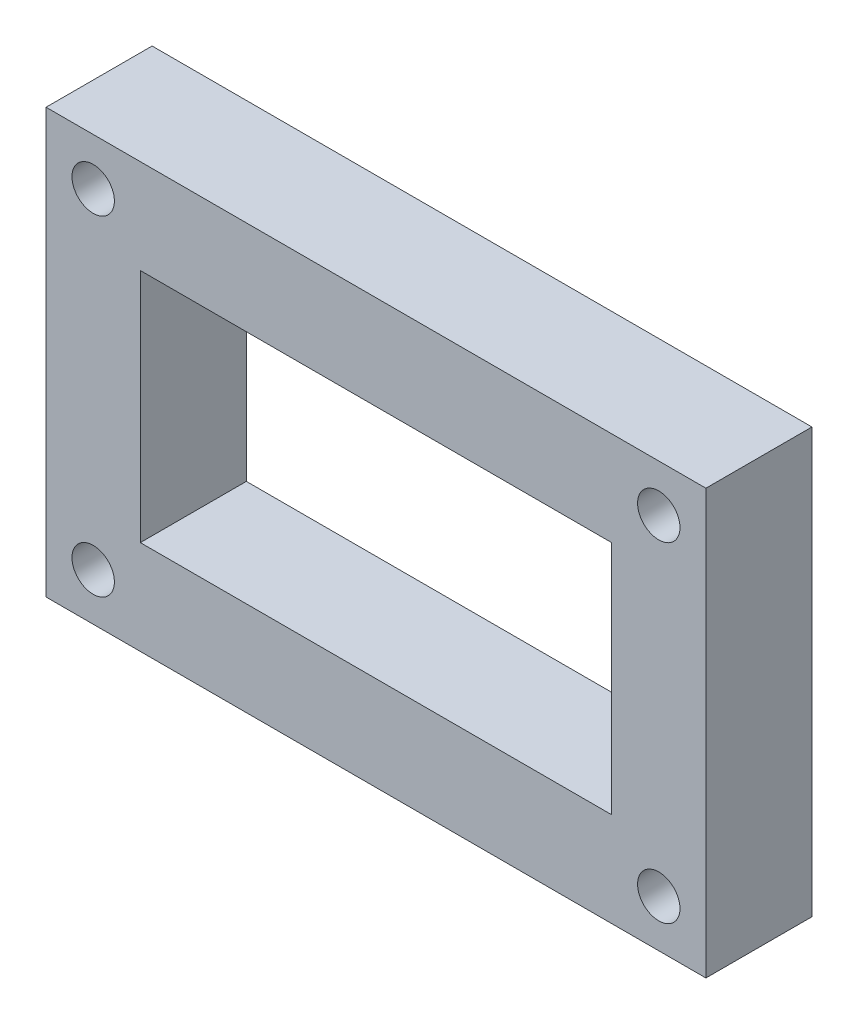
ISO-10303-21;
HEADER;
FILE_DESCRIPTION(('STEP AP214'),'2;1');
FILE_NAME('part.step','',(''),(''),'','','');
FILE_SCHEMA(('AUTOMOTIVE_DESIGN { 1 0 10303 214 1 1 1 1 }'));
ENDSEC;
DATA;
#1=APPLICATION_CONTEXT('core data for automotive mechanical design processes');
#2=APPLICATION_PROTOCOL_DEFINITION('international standard','automotive_design',2000,#1);
#3=PRODUCT_CONTEXT('',#1,'mechanical');
#4=PRODUCT('Part','Part','',(#3));
#5=PRODUCT_RELATED_PRODUCT_CATEGORY('part','',(#4));
#6=PRODUCT_DEFINITION_FORMATION('','',#4);
#7=PRODUCT_DEFINITION_CONTEXT('part definition',#1,'design');
#8=PRODUCT_DEFINITION('design','',#6,#7);
#9=PRODUCT_DEFINITION_SHAPE('','',#8);
#10=(LENGTH_UNIT() NAMED_UNIT(*) SI_UNIT(.MILLI.,.METRE.));
#11=(NAMED_UNIT(*) PLANE_ANGLE_UNIT() SI_UNIT($,.RADIAN.));
#12=(NAMED_UNIT(*) SI_UNIT($,.STERADIAN.) SOLID_ANGLE_UNIT());
#13=UNCERTAINTY_MEASURE_WITH_UNIT(LENGTH_MEASURE(1.E-05),#10,'distance_accuracy_value','');
#14=(GEOMETRIC_REPRESENTATION_CONTEXT(3) GLOBAL_UNCERTAINTY_ASSIGNED_CONTEXT((#13)) GLOBAL_UNIT_ASSIGNED_CONTEXT((#10,
#11,#12)) REPRESENTATION_CONTEXT('',''));
#15=CARTESIAN_POINT('',(0.,0.,0.));
#16=DIRECTION('',(0.,0.,1.));
#17=DIRECTION('',(1.,0.,0.));
#18=AXIS2_PLACEMENT_3D('',#15,#16,#17);
#19=CARTESIAN_POINT('',(0.,0.,11.43));
#20=DIRECTION('',(0.,0.,1.));
#21=DIRECTION('',(1.,0.,0.));
#22=AXIS2_PLACEMENT_3D('',#19,#20,#21);
#23=PLANE('',#22);
#24=CARTESIAN_POINT('',(30.48,-17.78,11.43));
#25=DIRECTION('',(0.,0.,1.));
#26=DIRECTION('',(1.,0.,0.));
#27=AXIS2_PLACEMENT_3D('',#24,#25,#26);
#28=CIRCLE('',#27,2.286);
#29=CARTESIAN_POINT('',(32.766,-17.78,11.43));
#30=VERTEX_POINT('',#29);
#31=EDGE_CURVE('E281',#30,#30,#28,.T.);
#32=ORIENTED_EDGE('',*,*,#31,.F.);
#33=EDGE_LOOP('',(#32));
#34=FACE_BOUND('',#33,.T.);
#35=CARTESIAN_POINT('',(-30.48,17.78,11.43));
#36=DIRECTION('',(0.,0.,1.));
#37=DIRECTION('',(1.,0.,0.));
#38=AXIS2_PLACEMENT_3D('',#35,#36,#37);
#39=CIRCLE('',#38,2.286);
#40=CARTESIAN_POINT('',(-28.194,17.78,11.43));
#41=VERTEX_POINT('',#40);
#42=EDGE_CURVE('E144',#41,#41,#39,.T.);
#43=ORIENTED_EDGE('',*,*,#42,.F.);
#44=EDGE_LOOP('',(#43));
#45=FACE_BOUND('',#44,.T.);
#46=DIRECTION('',(0.,1.,0.));
#47=VECTOR('',#46,1.);
#48=CARTESIAN_POINT('',(35.56,22.86,11.43));
#49=LINE('',#48,#47);
#50=CARTESIAN_POINT('',(35.56,-22.86,11.43));
#51=VERTEX_POINT('',#50);
#52=CARTESIAN_POINT('',(35.56,22.86,11.43));
#53=VERTEX_POINT('',#52);
#54=EDGE_CURVE('E160',#51,#53,#49,.T.);
#55=ORIENTED_EDGE('',*,*,#54,.T.);
#56=DIRECTION('',(-1.,0.,0.));
#57=VECTOR('',#56,1.);
#58=CARTESIAN_POINT('',(-35.56,22.86,11.43));
#59=LINE('',#58,#57);
#60=CARTESIAN_POINT('',(-35.56,22.86,11.43));
#61=VERTEX_POINT('',#60);
#62=EDGE_CURVE('E164',#53,#61,#59,.T.);
#63=ORIENTED_EDGE('',*,*,#62,.T.);
#64=DIRECTION('',(0.,-1.,0.));
#65=VECTOR('',#64,1.);
#66=CARTESIAN_POINT('',(-35.56,22.86,11.43));
#67=LINE('',#66,#65);
#68=CARTESIAN_POINT('',(-35.56,-22.86,11.43));
#69=VERTEX_POINT('',#68);
#70=EDGE_CURVE('E168',#61,#69,#67,.T.);
#71=ORIENTED_EDGE('',*,*,#70,.T.);
#72=DIRECTION('',(1.,0.,0.));
#73=VECTOR('',#72,1.);
#74=CARTESIAN_POINT('',(-35.56,-22.86,11.43));
#75=LINE('',#74,#73);
#76=EDGE_CURVE('E171',#69,#51,#75,.T.);
#77=ORIENTED_EDGE('',*,*,#76,.T.);
#78=EDGE_LOOP('',(#55,#63,#71,#77));
#79=FACE_BOUND('',#78,.T.);
#80=DIRECTION('',(-1.,0.,0.));
#81=VECTOR('',#80,1.);
#82=CARTESIAN_POINT('',(-25.4,12.7,11.43));
#83=LINE('',#82,#81);
#84=CARTESIAN_POINT('',(25.4,12.7,11.43));
#85=VERTEX_POINT('',#84);
#86=CARTESIAN_POINT('',(-25.4,12.7,11.43));
#87=VERTEX_POINT('',#86);
#88=EDGE_CURVE('E118',#85,#87,#83,.T.);
#89=ORIENTED_EDGE('',*,*,#88,.F.);
#90=DIRECTION('',(0.,1.,0.));
#91=VECTOR('',#90,1.);
#92=CARTESIAN_POINT('',(25.4,12.7,11.43));
#93=LINE('',#92,#91);
#94=CARTESIAN_POINT('',(25.4,-12.7,11.43));
#95=VERTEX_POINT('',#94);
#96=EDGE_CURVE('E109',#95,#85,#93,.T.);
#97=ORIENTED_EDGE('',*,*,#96,.F.);
#98=DIRECTION('',(1.,0.,0.));
#99=VECTOR('',#98,1.);
#100=CARTESIAN_POINT('',(-25.4,-12.7,11.43));
#101=LINE('',#100,#99);
#102=CARTESIAN_POINT('',(-25.4,-12.7,11.43));
#103=VERTEX_POINT('',#102);
#104=EDGE_CURVE('E136',#103,#95,#101,.T.);
#105=ORIENTED_EDGE('',*,*,#104,.F.);
#106=DIRECTION('',(0.,-1.,0.));
#107=VECTOR('',#106,1.);
#108=CARTESIAN_POINT('',(-25.4,12.7,11.43));
#109=LINE('',#108,#107);
#110=EDGE_CURVE('E132',#87,#103,#109,.T.);
#111=ORIENTED_EDGE('',*,*,#110,.F.);
#112=EDGE_LOOP('',(#89,#97,#105,#111));
#113=FACE_BOUND('',#112,.T.);
#114=CARTESIAN_POINT('',(-30.48,-17.78,11.43));
#115=DIRECTION('',(0.,0.,1.));
#116=DIRECTION('',(1.,0.,0.));
#117=AXIS2_PLACEMENT_3D('',#114,#115,#116);
#118=CIRCLE('',#117,2.286);
#119=CARTESIAN_POINT('',(-28.194,-17.78,11.43));
#120=VERTEX_POINT('',#119);
#121=EDGE_CURVE('E289',#120,#120,#118,.T.);
#122=ORIENTED_EDGE('',*,*,#121,.F.);
#123=EDGE_LOOP('',(#122));
#124=FACE_BOUND('',#123,.T.);
#125=CARTESIAN_POINT('',(30.48,17.78,11.43));
#126=DIRECTION('',(0.,0.,1.));
#127=DIRECTION('',(1.,0.,0.));
#128=AXIS2_PLACEMENT_3D('',#125,#126,#127);
#129=CIRCLE('',#128,2.286);
#130=CARTESIAN_POINT('',(32.766,17.78,11.43));
#131=VERTEX_POINT('',#130);
#132=EDGE_CURVE('E270',#131,#131,#129,.T.);
#133=ORIENTED_EDGE('',*,*,#132,.F.);
#134=EDGE_LOOP('',(#133));
#135=FACE_BOUND('',#134,.T.);
#136=ADVANCED_FACE('F43',(#34,#45,#79,#113,#124,#135),#23,.T.);
#137=CARTESIAN_POINT('',(0.,0.,0.));
#138=DIRECTION('',(0.,0.,1.));
#139=DIRECTION('',(1.,0.,0.));
#140=AXIS2_PLACEMENT_3D('',#137,#138,#139);
#141=PLANE('',#140);
#142=DIRECTION('',(0.,1.,0.));
#143=VECTOR('',#142,1.);
#144=CARTESIAN_POINT('',(35.56,22.86,0.));
#145=LINE('',#144,#143);
#146=CARTESIAN_POINT('',(35.56,-22.86,0.));
#147=VERTEX_POINT('',#146);
#148=CARTESIAN_POINT('',(35.56,22.86,0.));
#149=VERTEX_POINT('',#148);
#150=EDGE_CURVE('E127',#147,#149,#145,.T.);
#151=ORIENTED_EDGE('',*,*,#150,.F.);
#152=DIRECTION('',(1.,0.,0.));
#153=VECTOR('',#152,1.);
#154=CARTESIAN_POINT('',(-35.56,-22.86,0.));
#155=LINE('',#154,#153);
#156=CARTESIAN_POINT('',(-35.56,-22.86,0.));
#157=VERTEX_POINT('',#156);
#158=EDGE_CURVE('E165',#157,#147,#155,.T.);
#159=ORIENTED_EDGE('',*,*,#158,.F.);
#160=DIRECTION('',(0.,-1.,0.));
#161=VECTOR('',#160,1.);
#162=CARTESIAN_POINT('',(-35.56,22.86,0.));
#163=LINE('',#162,#161);
#164=CARTESIAN_POINT('',(-35.56,22.86,0.));
#165=VERTEX_POINT('',#164);
#166=EDGE_CURVE('E181',#165,#157,#163,.T.);
#167=ORIENTED_EDGE('',*,*,#166,.F.);
#168=DIRECTION('',(-1.,0.,0.));
#169=VECTOR('',#168,1.);
#170=CARTESIAN_POINT('',(-35.56,22.86,0.));
#171=LINE('',#170,#169);
#172=EDGE_CURVE('E178',#149,#165,#171,.T.);
#173=ORIENTED_EDGE('',*,*,#172,.F.);
#174=EDGE_LOOP('',(#151,#159,#167,#173));
#175=FACE_BOUND('',#174,.T.);
#176=DIRECTION('',(0.,1.,0.));
#177=VECTOR('',#176,1.);
#178=CARTESIAN_POINT('',(25.4,12.7,0.));
#179=LINE('',#178,#177);
#180=CARTESIAN_POINT('',(25.4,-12.7,0.));
#181=VERTEX_POINT('',#180);
#182=CARTESIAN_POINT('',(25.4,12.7,0.));
#183=VERTEX_POINT('',#182);
#184=EDGE_CURVE('E67',#181,#183,#179,.T.);
#185=ORIENTED_EDGE('',*,*,#184,.T.);
#186=DIRECTION('',(-1.,0.,0.));
#187=VECTOR('',#186,1.);
#188=CARTESIAN_POINT('',(-25.4,12.7,0.));
#189=LINE('',#188,#187);
#190=CARTESIAN_POINT('',(-25.4,12.7,0.));
#191=VERTEX_POINT('',#190);
#192=EDGE_CURVE('E125',#183,#191,#189,.T.);
#193=ORIENTED_EDGE('',*,*,#192,.T.);
#194=DIRECTION('',(0.,-1.,0.));
#195=VECTOR('',#194,1.);
#196=CARTESIAN_POINT('',(-25.4,12.7,0.));
#197=LINE('',#196,#195);
#198=CARTESIAN_POINT('',(-25.4,-12.7,0.));
#199=VERTEX_POINT('',#198);
#200=EDGE_CURVE('E147',#191,#199,#197,.T.);
#201=ORIENTED_EDGE('',*,*,#200,.T.);
#202=DIRECTION('',(1.,0.,0.));
#203=VECTOR('',#202,1.);
#204=CARTESIAN_POINT('',(-25.4,-12.7,0.));
#205=LINE('',#204,#203);
#206=EDGE_CURVE('E119',#199,#181,#205,.T.);
#207=ORIENTED_EDGE('',*,*,#206,.T.);
#208=EDGE_LOOP('',(#185,#193,#201,#207));
#209=FACE_BOUND('',#208,.T.);
#210=CARTESIAN_POINT('',(-30.48,17.78,0.));
#211=DIRECTION('',(0.,0.,1.));
#212=DIRECTION('',(1.,0.,0.));
#213=AXIS2_PLACEMENT_3D('',#210,#211,#212);
#214=CIRCLE('',#213,2.286);
#215=CARTESIAN_POINT('',(-28.194,17.78,0.));
#216=VERTEX_POINT('',#215);
#217=EDGE_CURVE('E293',#216,#216,#214,.T.);
#218=ORIENTED_EDGE('',*,*,#217,.T.);
#219=EDGE_LOOP('',(#218));
#220=FACE_BOUND('',#219,.T.);
#221=CARTESIAN_POINT('',(-30.48,-17.78,0.));
#222=DIRECTION('',(0.,0.,1.));
#223=DIRECTION('',(1.,0.,0.));
#224=AXIS2_PLACEMENT_3D('',#221,#222,#223);
#225=CIRCLE('',#224,2.286);
#226=CARTESIAN_POINT('',(-28.194,-17.78,0.));
#227=VERTEX_POINT('',#226);
#228=EDGE_CURVE('E285',#227,#227,#225,.T.);
#229=ORIENTED_EDGE('',*,*,#228,.T.);
#230=EDGE_LOOP('',(#229));
#231=FACE_BOUND('',#230,.T.);
#232=CARTESIAN_POINT('',(30.48,-17.78,0.));
#233=DIRECTION('',(0.,0.,1.));
#234=DIRECTION('',(1.,0.,0.));
#235=AXIS2_PLACEMENT_3D('',#232,#233,#234);
#236=CIRCLE('',#235,2.286);
#237=CARTESIAN_POINT('',(32.766,-17.78,0.));
#238=VERTEX_POINT('',#237);
#239=EDGE_CURVE('E278',#238,#238,#236,.T.);
#240=ORIENTED_EDGE('',*,*,#239,.T.);
#241=EDGE_LOOP('',(#240));
#242=FACE_BOUND('',#241,.T.);
#243=CARTESIAN_POINT('',(30.48,17.78,0.));
#244=DIRECTION('',(0.,0.,1.));
#245=DIRECTION('',(1.,0.,0.));
#246=AXIS2_PLACEMENT_3D('',#243,#244,#245);
#247=CIRCLE('',#246,2.286);
#248=CARTESIAN_POINT('',(32.766,17.78,0.));
#249=VERTEX_POINT('',#248);
#250=EDGE_CURVE('E273',#249,#249,#247,.T.);
#251=ORIENTED_EDGE('',*,*,#250,.T.);
#252=EDGE_LOOP('',(#251));
#253=FACE_BOUND('',#252,.T.);
#254=ADVANCED_FACE('F204',(#175,#209,#220,#231,#242,#253),#141,.F.);
#255=CARTESIAN_POINT('',(35.56,22.86,11.43));
#256=DIRECTION('',(-1.,0.,0.));
#257=DIRECTION('',(0.,0.,1.));
#258=AXIS2_PLACEMENT_3D('',#255,#256,#257);
#259=PLANE('',#258);
#260=ORIENTED_EDGE('',*,*,#150,.T.);
#261=DIRECTION('',(0.,0.,-1.));
#262=VECTOR('',#261,1.);
#263=CARTESIAN_POINT('',(35.56,22.86,11.43));
#264=LINE('',#263,#262);
#265=EDGE_CURVE('E11',#53,#149,#264,.T.);
#266=ORIENTED_EDGE('',*,*,#265,.F.);
#267=ORIENTED_EDGE('',*,*,#54,.F.);
#268=DIRECTION('',(0.,0.,-1.));
#269=VECTOR('',#268,1.);
#270=CARTESIAN_POINT('',(35.56,-22.86,11.43));
#271=LINE('',#270,#269);
#272=EDGE_CURVE('E174',#51,#147,#271,.T.);
#273=ORIENTED_EDGE('',*,*,#272,.T.);
#274=EDGE_LOOP('',(#260,#266,#267,#273));
#275=FACE_BOUND('',#274,.T.);
#276=ADVANCED_FACE('F45',(#275),#259,.F.);
#277=CARTESIAN_POINT('',(-35.56,22.86,11.43));
#278=DIRECTION('',(0.,-1.,0.));
#279=DIRECTION('',(0.,0.,-1.));
#280=AXIS2_PLACEMENT_3D('',#277,#278,#279);
#281=PLANE('',#280);
#282=ORIENTED_EDGE('',*,*,#172,.T.);
#283=DIRECTION('',(0.,0.,-1.));
#284=VECTOR('',#283,1.);
#285=CARTESIAN_POINT('',(-35.56,22.86,11.43));
#286=LINE('',#285,#284);
#287=EDGE_CURVE('E52',#61,#165,#286,.T.);
#288=ORIENTED_EDGE('',*,*,#287,.F.);
#289=ORIENTED_EDGE('',*,*,#62,.F.);
#290=ORIENTED_EDGE('',*,*,#265,.T.);
#291=EDGE_LOOP('',(#282,#288,#289,#290));
#292=FACE_BOUND('',#291,.T.);
#293=ADVANCED_FACE('F214',(#292),#281,.F.);
#294=CARTESIAN_POINT('',(-35.56,22.86,11.43));
#295=DIRECTION('',(1.,0.,0.));
#296=DIRECTION('',(0.,0.,-1.));
#297=AXIS2_PLACEMENT_3D('',#294,#295,#296);
#298=PLANE('',#297);
#299=ORIENTED_EDGE('',*,*,#166,.T.);
#300=DIRECTION('',(0.,0.,-1.));
#301=VECTOR('',#300,1.);
#302=CARTESIAN_POINT('',(-35.56,-22.86,11.43));
#303=LINE('',#302,#301);
#304=EDGE_CURVE('E189',#69,#157,#303,.T.);
#305=ORIENTED_EDGE('',*,*,#304,.F.);
#306=ORIENTED_EDGE('',*,*,#70,.F.);
#307=ORIENTED_EDGE('',*,*,#287,.T.);
#308=EDGE_LOOP('',(#299,#305,#306,#307));
#309=FACE_BOUND('',#308,.T.);
#310=ADVANCED_FACE('F198',(#309),#298,.F.);
#311=CARTESIAN_POINT('',(-35.56,-22.86,11.43));
#312=DIRECTION('',(0.,1.,0.));
#313=DIRECTION('',(0.,0.,1.));
#314=AXIS2_PLACEMENT_3D('',#311,#312,#313);
#315=PLANE('',#314);
#316=ORIENTED_EDGE('',*,*,#158,.T.);
#317=ORIENTED_EDGE('',*,*,#272,.F.);
#318=ORIENTED_EDGE('',*,*,#76,.F.);
#319=ORIENTED_EDGE('',*,*,#304,.T.);
#320=EDGE_LOOP('',(#316,#317,#318,#319));
#321=FACE_BOUND('',#320,.T.);
#322=ADVANCED_FACE('F208',(#321),#315,.F.);
#323=CARTESIAN_POINT('',(25.4,12.7,11.43));
#324=DIRECTION('',(-1.,0.,0.));
#325=DIRECTION('',(0.,0.,1.));
#326=AXIS2_PLACEMENT_3D('',#323,#324,#325);
#327=PLANE('',#326);
#328=ORIENTED_EDGE('',*,*,#184,.F.);
#329=DIRECTION('',(0.,0.,-1.));
#330=VECTOR('',#329,1.);
#331=CARTESIAN_POINT('',(25.4,-12.7,11.43));
#332=LINE('',#331,#330);
#333=EDGE_CURVE('E113',#95,#181,#332,.T.);
#334=ORIENTED_EDGE('',*,*,#333,.F.);
#335=ORIENTED_EDGE('',*,*,#96,.T.);
#336=DIRECTION('',(0.,0.,-1.));
#337=VECTOR('',#336,1.);
#338=CARTESIAN_POINT('',(25.4,12.7,11.43));
#339=LINE('',#338,#337);
#340=EDGE_CURVE('E112',#85,#183,#339,.T.);
#341=ORIENTED_EDGE('',*,*,#340,.T.);
#342=EDGE_LOOP('',(#328,#334,#335,#341));
#343=FACE_BOUND('',#342,.T.);
#344=ADVANCED_FACE('F111',(#343),#327,.T.);
#345=CARTESIAN_POINT('',(-25.4,12.7,11.43));
#346=DIRECTION('',(0.,-1.,0.));
#347=DIRECTION('',(0.,0.,-1.));
#348=AXIS2_PLACEMENT_3D('',#345,#346,#347);
#349=PLANE('',#348);
#350=ORIENTED_EDGE('',*,*,#192,.F.);
#351=ORIENTED_EDGE('',*,*,#340,.F.);
#352=ORIENTED_EDGE('',*,*,#88,.T.);
#353=DIRECTION('',(0.,0.,-1.));
#354=VECTOR('',#353,1.);
#355=CARTESIAN_POINT('',(-25.4,12.7,11.43));
#356=LINE('',#355,#354);
#357=EDGE_CURVE('E128',#87,#191,#356,.T.);
#358=ORIENTED_EDGE('',*,*,#357,.T.);
#359=EDGE_LOOP('',(#350,#351,#352,#358));
#360=FACE_BOUND('',#359,.T.);
#361=ADVANCED_FACE('F122',(#360),#349,.T.);
#362=CARTESIAN_POINT('',(-25.4,12.7,11.43));
#363=DIRECTION('',(1.,0.,0.));
#364=DIRECTION('',(0.,1.,0.));
#365=AXIS2_PLACEMENT_3D('',#362,#363,#364);
#366=PLANE('',#365);
#367=ORIENTED_EDGE('',*,*,#200,.F.);
#368=ORIENTED_EDGE('',*,*,#357,.F.);
#369=ORIENTED_EDGE('',*,*,#110,.T.);
#370=DIRECTION('',(0.,0.,-1.));
#371=VECTOR('',#370,1.);
#372=CARTESIAN_POINT('',(-25.4,-12.7,11.43));
#373=LINE('',#372,#371);
#374=EDGE_CURVE('E59',#103,#199,#373,.T.);
#375=ORIENTED_EDGE('',*,*,#374,.T.);
#376=EDGE_LOOP('',(#367,#368,#369,#375));
#377=FACE_BOUND('',#376,.T.);
#378=ADVANCED_FACE('F240',(#377),#366,.T.);
#379=CARTESIAN_POINT('',(-25.4,-12.7,11.43));
#380=DIRECTION('',(0.,1.,0.));
#381=DIRECTION('',(0.,0.,1.));
#382=AXIS2_PLACEMENT_3D('',#379,#380,#381);
#383=PLANE('',#382);
#384=ORIENTED_EDGE('',*,*,#206,.F.);
#385=ORIENTED_EDGE('',*,*,#374,.F.);
#386=ORIENTED_EDGE('',*,*,#104,.T.);
#387=ORIENTED_EDGE('',*,*,#333,.T.);
#388=EDGE_LOOP('',(#384,#385,#386,#387));
#389=FACE_BOUND('',#388,.T.);
#390=ADVANCED_FACE('F244',(#389),#383,.T.);
#391=CARTESIAN_POINT('',(-30.48,17.78,11.43));
#392=DIRECTION('',(0.,0.,-1.));
#393=DIRECTION('',(-1.,0.,0.));
#394=AXIS2_PLACEMENT_3D('',#391,#392,#393);
#395=CYLINDRICAL_SURFACE('',#394,2.286);
#396=ORIENTED_EDGE('',*,*,#42,.T.);
#397=EDGE_LOOP('',(#396));
#398=FACE_BOUND('',#397,.T.);
#399=ORIENTED_EDGE('',*,*,#217,.F.);
#400=EDGE_LOOP('',(#399));
#401=FACE_BOUND('',#400,.T.);
#402=ADVANCED_FACE('F250',(#398,#401),#395,.F.);
#403=CARTESIAN_POINT('',(-30.48,-17.78,11.43));
#404=DIRECTION('',(0.,0.,-1.));
#405=DIRECTION('',(-1.,0.,0.));
#406=AXIS2_PLACEMENT_3D('',#403,#404,#405);
#407=CYLINDRICAL_SURFACE('',#406,2.286);
#408=ORIENTED_EDGE('',*,*,#121,.T.);
#409=EDGE_LOOP('',(#408));
#410=FACE_BOUND('',#409,.T.);
#411=ORIENTED_EDGE('',*,*,#228,.F.);
#412=EDGE_LOOP('',(#411));
#413=FACE_BOUND('',#412,.T.);
#414=ADVANCED_FACE('F253',(#410,#413),#407,.F.);
#415=CARTESIAN_POINT('',(30.48,-17.78,11.43));
#416=DIRECTION('',(0.,0.,-1.));
#417=DIRECTION('',(-1.,0.,0.));
#418=AXIS2_PLACEMENT_3D('',#415,#416,#417);
#419=CYLINDRICAL_SURFACE('',#418,2.286);
#420=ORIENTED_EDGE('',*,*,#31,.T.);
#421=EDGE_LOOP('',(#420));
#422=FACE_BOUND('',#421,.T.);
#423=ORIENTED_EDGE('',*,*,#239,.F.);
#424=EDGE_LOOP('',(#423));
#425=FACE_BOUND('',#424,.T.);
#426=ADVANCED_FACE('F257',(#422,#425),#419,.F.);
#427=CARTESIAN_POINT('',(30.48,17.78,11.43));
#428=DIRECTION('',(0.,0.,-1.));
#429=DIRECTION('',(-1.,0.,0.));
#430=AXIS2_PLACEMENT_3D('',#427,#428,#429);
#431=CYLINDRICAL_SURFACE('',#430,2.286);
#432=ORIENTED_EDGE('',*,*,#132,.T.);
#433=EDGE_LOOP('',(#432));
#434=FACE_BOUND('',#433,.T.);
#435=ORIENTED_EDGE('',*,*,#250,.F.);
#436=EDGE_LOOP('',(#435));
#437=FACE_BOUND('',#436,.T.);
#438=ADVANCED_FACE('F261',(#434,#437),#431,.F.);
#439=CLOSED_SHELL('',(#136,#254,#276,#293,#310,#322,#344,#361,#378,#390,#402,#414,#426,#438));
#440=MANIFOLD_SOLID_BREP('B2',#439);
#441=ADVANCED_BREP_SHAPE_REPRESENTATION('',(#18,#440),#14);
#442=SHAPE_DEFINITION_REPRESENTATION(#9,#441);
ENDSEC;
END-ISO-10303-21;
